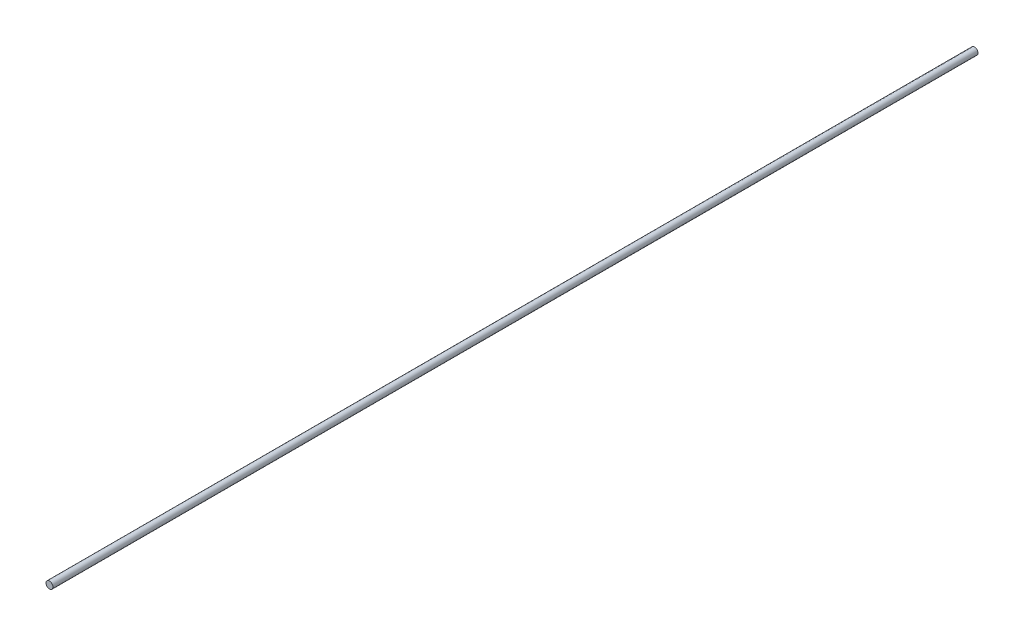
ISO-10303-21;
HEADER;
FILE_DESCRIPTION(('STEP AP214'),'2;1');
FILE_NAME('part.step','',(''),(''),'','','');
FILE_SCHEMA(('AUTOMOTIVE_DESIGN { 1 0 10303 214 1 1 1 1 }'));
ENDSEC;
DATA;
#1=APPLICATION_CONTEXT('core data for automotive mechanical design processes');
#2=APPLICATION_PROTOCOL_DEFINITION('international standard','automotive_design',2000,#1);
#3=PRODUCT_CONTEXT('',#1,'mechanical');
#4=PRODUCT('Part','Part','',(#3));
#5=PRODUCT_RELATED_PRODUCT_CATEGORY('part','',(#4));
#6=PRODUCT_DEFINITION_FORMATION('','',#4);
#7=PRODUCT_DEFINITION_CONTEXT('part definition',#1,'design');
#8=PRODUCT_DEFINITION('design','',#6,#7);
#9=PRODUCT_DEFINITION_SHAPE('','',#8);
#10=(LENGTH_UNIT() NAMED_UNIT(*) SI_UNIT(.MILLI.,.METRE.));
#11=(NAMED_UNIT(*) PLANE_ANGLE_UNIT() SI_UNIT($,.RADIAN.));
#12=(NAMED_UNIT(*) SI_UNIT($,.STERADIAN.) SOLID_ANGLE_UNIT());
#13=UNCERTAINTY_MEASURE_WITH_UNIT(LENGTH_MEASURE(1.E-05),#10,'distance_accuracy_value','');
#14=(GEOMETRIC_REPRESENTATION_CONTEXT(3) GLOBAL_UNCERTAINTY_ASSIGNED_CONTEXT((#13)) GLOBAL_UNIT_ASSIGNED_CONTEXT((#10,
#11,#12)) REPRESENTATION_CONTEXT('',''));
#15=CARTESIAN_POINT('',(0.,0.,0.));
#16=DIRECTION('',(0.,0.,1.));
#17=DIRECTION('',(1.,0.,0.));
#18=AXIS2_PLACEMENT_3D('',#15,#16,#17);
#19=CARTESIAN_POINT('',(0.,0.,-400.));
#20=DIRECTION('',(0.,0.,1.));
#21=DIRECTION('',(1.,0.,0.));
#22=AXIS2_PLACEMENT_3D('',#19,#20,#21);
#23=CYLINDRICAL_SURFACE('',#22,1.5);
#24=CARTESIAN_POINT('',(0.,0.,-400.));
#25=DIRECTION('',(0.,0.,1.));
#26=DIRECTION('',(1.,0.,0.));
#27=AXIS2_PLACEMENT_3D('',#24,#25,#26);
#28=CIRCLE('',#27,1.5);
#29=CARTESIAN_POINT('',(1.5,0.,-400.));
#30=VERTEX_POINT('',#29);
#31=EDGE_CURVE('E10',#30,#30,#28,.T.);
#32=ORIENTED_EDGE('',*,*,#31,.T.);
#33=EDGE_LOOP('',(#32));
#34=FACE_BOUND('',#33,.T.);
#35=CARTESIAN_POINT('',(0.,0.,0.));
#36=DIRECTION('',(0.,0.,1.));
#37=DIRECTION('',(1.,0.,0.));
#38=AXIS2_PLACEMENT_3D('',#35,#36,#37);
#39=CIRCLE('',#38,1.5);
#40=CARTESIAN_POINT('',(1.5,0.,0.));
#41=VERTEX_POINT('',#40);
#42=EDGE_CURVE('E42',#41,#41,#39,.T.);
#43=ORIENTED_EDGE('',*,*,#42,.F.);
#44=EDGE_LOOP('',(#43));
#45=FACE_BOUND('',#44,.T.);
#46=ADVANCED_FACE('F39',(#34,#45),#23,.T.);
#47=CARTESIAN_POINT('',(0.,0.,-400.));
#48=DIRECTION('',(0.,0.,1.));
#49=DIRECTION('',(1.,0.,0.));
#50=AXIS2_PLACEMENT_3D('',#47,#48,#49);
#51=PLANE('',#50);
#52=ORIENTED_EDGE('',*,*,#31,.F.);
#53=EDGE_LOOP('',(#52));
#54=FACE_BOUND('',#53,.T.);
#55=ADVANCED_FACE('F54',(#54),#51,.F.);
#56=CARTESIAN_POINT('',(0.,0.,0.));
#57=DIRECTION('',(0.,0.,1.));
#58=DIRECTION('',(1.,0.,0.));
#59=AXIS2_PLACEMENT_3D('',#56,#57,#58);
#60=PLANE('',#59);
#61=ORIENTED_EDGE('',*,*,#42,.T.);
#62=EDGE_LOOP('',(#61));
#63=FACE_BOUND('',#62,.T.);
#64=ADVANCED_FACE('F51',(#63),#60,.T.);
#65=CLOSED_SHELL('',(#46,#55,#64));
#66=MANIFOLD_SOLID_BREP('B2',#65);
#67=ADVANCED_BREP_SHAPE_REPRESENTATION('',(#18,#66),#14);
#68=SHAPE_DEFINITION_REPRESENTATION(#9,#67);
ENDSEC;
END-ISO-10303-21;
